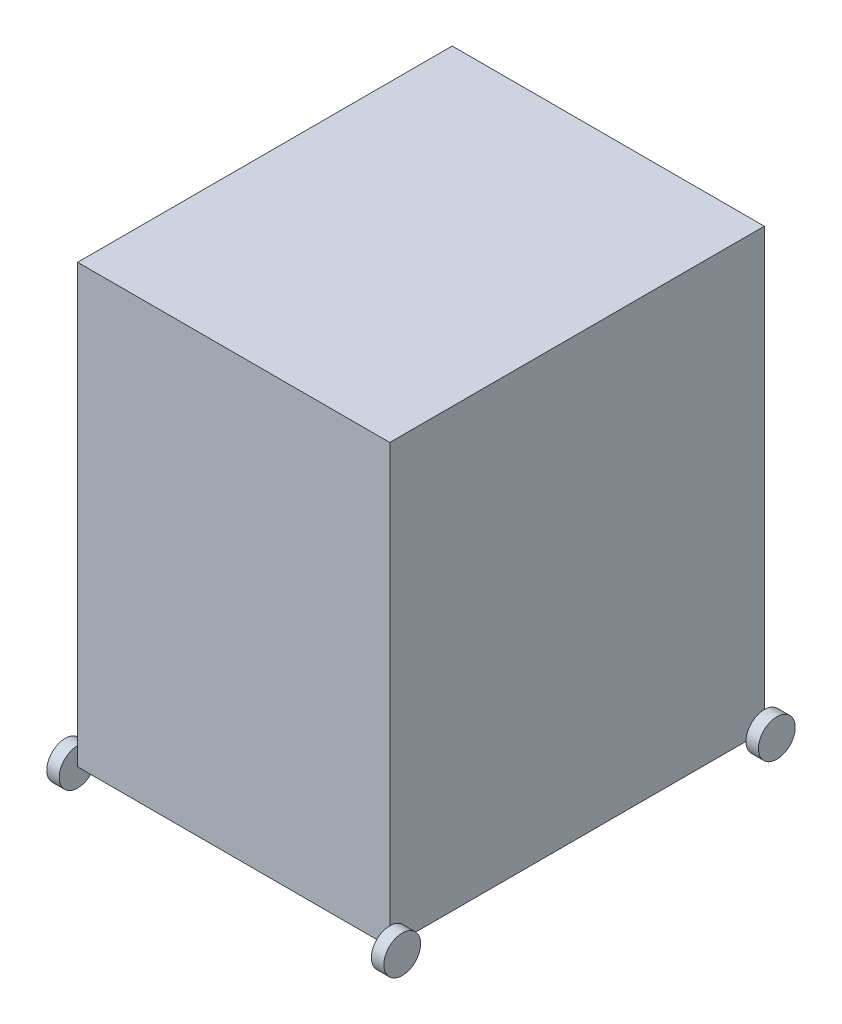
ISO-10303-21;
HEADER;
FILE_DESCRIPTION(('STEP AP214'),'2;1');
FILE_NAME('part.step','',(''),(''),'','','');
FILE_SCHEMA(('AUTOMOTIVE_DESIGN { 1 0 10303 214 1 1 1 1 }'));
ENDSEC;
DATA;
#1=APPLICATION_CONTEXT('core data for automotive mechanical design processes');
#2=APPLICATION_PROTOCOL_DEFINITION('international standard','automotive_design',2000,#1);
#3=PRODUCT_CONTEXT('',#1,'mechanical');
#4=PRODUCT('Part','Part','',(#3));
#5=PRODUCT_RELATED_PRODUCT_CATEGORY('part','',(#4));
#6=PRODUCT_DEFINITION_FORMATION('','',#4);
#7=PRODUCT_DEFINITION_CONTEXT('part definition',#1,'design');
#8=PRODUCT_DEFINITION('design','',#6,#7);
#9=PRODUCT_DEFINITION_SHAPE('','',#8);
#10=(LENGTH_UNIT() NAMED_UNIT(*) SI_UNIT(.MILLI.,.METRE.));
#11=(NAMED_UNIT(*) PLANE_ANGLE_UNIT() SI_UNIT($,.RADIAN.));
#12=(NAMED_UNIT(*) SI_UNIT($,.STERADIAN.) SOLID_ANGLE_UNIT());
#13=UNCERTAINTY_MEASURE_WITH_UNIT(LENGTH_MEASURE(1.E-05),#10,'distance_accuracy_value','');
#14=(GEOMETRIC_REPRESENTATION_CONTEXT(3) GLOBAL_UNCERTAINTY_ASSIGNED_CONTEXT((#13)) GLOBAL_UNIT_ASSIGNED_CONTEXT((#10,
#11,#12)) REPRESENTATION_CONTEXT('',''));
#15=CARTESIAN_POINT('',(0.,0.,0.));
#16=DIRECTION('',(0.,0.,1.));
#17=DIRECTION('',(1.,0.,0.));
#18=AXIS2_PLACEMENT_3D('',#15,#16,#17);
#19=CARTESIAN_POINT('',(-154.444356890843,350.,75.1575717903757));
#20=DIRECTION('',(1.,0.,0.));
#21=DIRECTION('',(0.,0.,-1.));
#22=AXIS2_PLACEMENT_3D('',#19,#20,#21);
#23=PLANE('',#22);
#24=CARTESIAN_POINT('',(-154.444356890843,0.,-224.842428209624));
#25=DIRECTION('',(1.,0.,0.));
#26=DIRECTION('',(0.,0.,-1.));
#27=AXIS2_PLACEMENT_3D('',#24,#25,#26);
#28=CIRCLE('',#27,14.75);
#29=CARTESIAN_POINT('',(-154.444356890843,14.75,-224.842428209624));
#30=VERTEX_POINT('',#29);
#31=CARTESIAN_POINT('',(-154.444356890843,0.,-210.092428209624));
#32=VERTEX_POINT('',#31);
#33=EDGE_CURVE('E110',#30,#32,#28,.T.);
#34=ORIENTED_EDGE('',*,*,#33,.T.);
#35=DIRECTION('',(0.,0.,1.));
#36=VECTOR('',#35,1.);
#37=CARTESIAN_POINT('',(-154.444356890843,0.,75.1575717903757));
#38=LINE('',#37,#36);
#39=CARTESIAN_POINT('',(-154.444356890843,0.,60.4075717903757));
#40=VERTEX_POINT('',#39);
#41=EDGE_CURVE('E99',#32,#40,#38,.T.);
#42=ORIENTED_EDGE('',*,*,#41,.T.);
#43=CARTESIAN_POINT('',(-154.444356890843,0.,75.1575717903757));
#44=DIRECTION('',(1.,0.,0.));
#45=DIRECTION('',(0.,0.,-1.));
#46=AXIS2_PLACEMENT_3D('',#43,#44,#45);
#47=CIRCLE('',#46,14.75);
#48=CARTESIAN_POINT('',(-154.444356890843,14.75,75.1575717903757));
#49=VERTEX_POINT('',#48);
#50=EDGE_CURVE('E129',#40,#49,#47,.T.);
#51=ORIENTED_EDGE('',*,*,#50,.T.);
#52=DIRECTION('',(0.,-1.,0.));
#53=VECTOR('',#52,1.);
#54=CARTESIAN_POINT('',(-154.444356890843,350.,75.1575717903757));
#55=LINE('',#54,#53);
#56=CARTESIAN_POINT('',(-154.444356890843,350.,75.1575717903757));
#57=VERTEX_POINT('',#56);
#58=EDGE_CURVE('E11',#57,#49,#55,.T.);
#59=ORIENTED_EDGE('',*,*,#58,.F.);
#60=DIRECTION('',(0.,0.,1.));
#61=VECTOR('',#60,1.);
#62=CARTESIAN_POINT('',(-154.444356890843,350.,75.1575717903757));
#63=LINE('',#62,#61);
#64=CARTESIAN_POINT('',(-154.444356890843,350.,-224.842428209624));
#65=VERTEX_POINT('',#64);
#66=EDGE_CURVE('E150',#65,#57,#63,.T.);
#67=ORIENTED_EDGE('',*,*,#66,.F.);
#68=DIRECTION('',(0.,-1.,0.));
#69=VECTOR('',#68,1.);
#70=CARTESIAN_POINT('',(-154.444356890843,350.,-224.842428209624));
#71=LINE('',#70,#69);
#72=EDGE_CURVE('E112',#65,#30,#71,.T.);
#73=ORIENTED_EDGE('',*,*,#72,.T.);
#74=EDGE_LOOP('',(#34,#42,#51,#59,#67,#73));
#75=FACE_BOUND('',#74,.T.);
#76=ADVANCED_FACE('F33',(#75),#23,.F.);
#77=CARTESIAN_POINT('',(95.5556431091574,350.,75.1575717903757));
#78=DIRECTION('',(-1.,0.,0.));
#79=DIRECTION('',(0.,0.,1.));
#80=AXIS2_PLACEMENT_3D('',#77,#78,#79);
#81=PLANE('',#80);
#82=CARTESIAN_POINT('',(95.5556431091574,0.,-224.842428209624));
#83=DIRECTION('',(1.,0.,0.));
#84=DIRECTION('',(0.,0.,-1.));
#85=AXIS2_PLACEMENT_3D('',#82,#83,#84);
#86=CIRCLE('',#85,14.75);
#87=CARTESIAN_POINT('',(95.5556431091574,14.75,-224.842428209624));
#88=VERTEX_POINT('',#87);
#89=CARTESIAN_POINT('',(95.5556431091574,0.,-210.092428209624));
#90=VERTEX_POINT('',#89);
#91=EDGE_CURVE('E138',#88,#90,#86,.T.);
#92=ORIENTED_EDGE('',*,*,#91,.F.);
#93=DIRECTION('',(0.,-1.,0.));
#94=VECTOR('',#93,1.);
#95=CARTESIAN_POINT('',(95.5556431091574,350.,-224.842428209624));
#96=LINE('',#95,#94);
#97=CARTESIAN_POINT('',(95.5556431091574,350.,-224.842428209624));
#98=VERTEX_POINT('',#97);
#99=EDGE_CURVE('E168',#98,#88,#96,.T.);
#100=ORIENTED_EDGE('',*,*,#99,.F.);
#101=DIRECTION('',(0.,0.,-1.));
#102=VECTOR('',#101,1.);
#103=CARTESIAN_POINT('',(95.5556431091574,350.,75.1575717903757));
#104=LINE('',#103,#102);
#105=CARTESIAN_POINT('',(95.5556431091574,350.,75.1575717903757));
#106=VERTEX_POINT('',#105);
#107=EDGE_CURVE('E156',#106,#98,#104,.T.);
#108=ORIENTED_EDGE('',*,*,#107,.F.);
#109=DIRECTION('',(0.,-1.,0.));
#110=VECTOR('',#109,1.);
#111=CARTESIAN_POINT('',(95.5556431091574,350.,75.1575717903757));
#112=LINE('',#111,#110);
#113=CARTESIAN_POINT('',(95.5556431091574,14.75,75.1575717903757));
#114=VERTEX_POINT('',#113);
#115=EDGE_CURVE('E171',#106,#114,#112,.T.);
#116=ORIENTED_EDGE('',*,*,#115,.T.);
#117=CARTESIAN_POINT('',(95.5556431091574,0.,75.1575717903757));
#118=DIRECTION('',(1.,0.,0.));
#119=DIRECTION('',(0.,0.,-1.));
#120=AXIS2_PLACEMENT_3D('',#117,#118,#119);
#121=CIRCLE('',#120,14.75);
#122=CARTESIAN_POINT('',(95.5556431091574,0.,60.4075717903757));
#123=VERTEX_POINT('',#122);
#124=EDGE_CURVE('E147',#123,#114,#121,.T.);
#125=ORIENTED_EDGE('',*,*,#124,.F.);
#126=DIRECTION('',(0.,0.,-1.));
#127=VECTOR('',#126,1.);
#128=CARTESIAN_POINT('',(95.5556431091574,0.,75.1575717903757));
#129=LINE('',#128,#127);
#130=EDGE_CURVE('E165',#123,#90,#129,.T.);
#131=ORIENTED_EDGE('',*,*,#130,.T.);
#132=EDGE_LOOP('',(#92,#100,#108,#116,#125,#131));
#133=FACE_BOUND('',#132,.T.);
#134=ADVANCED_FACE('F196',(#133),#81,.F.);
#135=CARTESIAN_POINT('',(-154.444356890843,350.,75.1575717903757));
#136=DIRECTION('',(0.,0.,-1.));
#137=DIRECTION('',(-1.,0.,0.));
#138=AXIS2_PLACEMENT_3D('',#135,#136,#137);
#139=PLANE('',#138);
#140=DIRECTION('',(1.,0.,0.));
#141=VECTOR('',#140,1.);
#142=CARTESIAN_POINT('',(-154.444356890843,0.,75.1575717903757));
#143=LINE('',#142,#141);
#144=CARTESIAN_POINT('',(-154.444356890843,0.,75.1575717903757));
#145=VERTEX_POINT('',#144);
#146=CARTESIAN_POINT('',(95.5556431091574,0.,75.1575717903757));
#147=VERTEX_POINT('',#146);
#148=EDGE_CURVE('E120',#145,#147,#143,.T.);
#149=ORIENTED_EDGE('',*,*,#148,.T.);
#150=EDGE_CURVE('E170',#114,#147,#112,.T.);
#151=ORIENTED_EDGE('',*,*,#150,.F.);
#152=ORIENTED_EDGE('',*,*,#115,.F.);
#153=DIRECTION('',(1.,0.,0.));
#154=VECTOR('',#153,1.);
#155=CARTESIAN_POINT('',(-154.444356890843,350.,75.1575717903757));
#156=LINE('',#155,#154);
#157=EDGE_CURVE('E153',#57,#106,#156,.T.);
#158=ORIENTED_EDGE('',*,*,#157,.F.);
#159=ORIENTED_EDGE('',*,*,#58,.T.);
#160=EDGE_CURVE('E40',#49,#145,#55,.T.);
#161=ORIENTED_EDGE('',*,*,#160,.T.);
#162=EDGE_LOOP('',(#149,#151,#152,#158,#159,#161));
#163=FACE_BOUND('',#162,.T.);
#164=ADVANCED_FACE('F184',(#163),#139,.F.);
#165=CARTESIAN_POINT('',(-154.444356890843,350.,-224.842428209624));
#166=DIRECTION('',(0.,0.,1.));
#167=DIRECTION('',(1.,0.,0.));
#168=AXIS2_PLACEMENT_3D('',#165,#166,#167);
#169=PLANE('',#168);
#170=DIRECTION('',(-1.,0.,0.));
#171=VECTOR('',#170,1.);
#172=CARTESIAN_POINT('',(-154.444356890843,0.,-224.842428209624));
#173=LINE('',#172,#171);
#174=CARTESIAN_POINT('',(95.5556431091574,0.,-224.842428209624));
#175=VERTEX_POINT('',#174);
#176=CARTESIAN_POINT('',(-154.444356890843,0.,-224.842428209624));
#177=VERTEX_POINT('',#176);
#178=EDGE_CURVE('E154',#175,#177,#173,.T.);
#179=ORIENTED_EDGE('',*,*,#178,.T.);
#180=DIRECTION('',(0.,1.,0.));
#181=VECTOR('',#180,1.);
#182=CARTESIAN_POINT('',(-154.444356890843,350.,-224.842428209624));
#183=LINE('',#182,#181);
#184=EDGE_CURVE('E47',#177,#30,#183,.T.);
#185=ORIENTED_EDGE('',*,*,#184,.T.);
#186=ORIENTED_EDGE('',*,*,#72,.F.);
#187=DIRECTION('',(-1.,0.,0.));
#188=VECTOR('',#187,1.);
#189=CARTESIAN_POINT('',(-154.444356890843,350.,-224.842428209624));
#190=LINE('',#189,#188);
#191=EDGE_CURVE('E158',#98,#65,#190,.T.);
#192=ORIENTED_EDGE('',*,*,#191,.F.);
#193=ORIENTED_EDGE('',*,*,#99,.T.);
#194=DIRECTION('',(0.,1.,0.));
#195=VECTOR('',#194,1.);
#196=CARTESIAN_POINT('',(95.5556431091574,350.,-224.842428209624));
#197=LINE('',#196,#195);
#198=EDGE_CURVE('E137',#175,#88,#197,.T.);
#199=ORIENTED_EDGE('',*,*,#198,.F.);
#200=EDGE_LOOP('',(#179,#185,#186,#192,#193,#199));
#201=FACE_BOUND('',#200,.T.);
#202=ADVANCED_FACE('F198',(#201),#169,.F.);
#203=CARTESIAN_POINT('',(0.,350.,0.));
#204=DIRECTION('',(0.,-1.,0.));
#205=DIRECTION('',(0.,0.,-1.));
#206=AXIS2_PLACEMENT_3D('',#203,#204,#205);
#207=PLANE('',#206);
#208=ORIENTED_EDGE('',*,*,#66,.T.);
#209=ORIENTED_EDGE('',*,*,#157,.T.);
#210=ORIENTED_EDGE('',*,*,#107,.T.);
#211=ORIENTED_EDGE('',*,*,#191,.T.);
#212=EDGE_LOOP('',(#208,#209,#210,#211));
#213=FACE_BOUND('',#212,.T.);
#214=ADVANCED_FACE('F200',(#213),#207,.F.);
#215=CARTESIAN_POINT('',(0.,0.,0.));
#216=DIRECTION('',(0.,-1.,0.));
#217=DIRECTION('',(0.,0.,-1.));
#218=AXIS2_PLACEMENT_3D('',#215,#216,#217);
#219=PLANE('',#218);
#220=EDGE_CURVE('E103',#177,#32,#38,.T.);
#221=ORIENTED_EDGE('',*,*,#220,.F.);
#222=ORIENTED_EDGE('',*,*,#178,.F.);
#223=EDGE_CURVE('E161',#90,#175,#129,.T.);
#224=ORIENTED_EDGE('',*,*,#223,.F.);
#225=ORIENTED_EDGE('',*,*,#130,.F.);
#226=EDGE_CURVE('E162',#147,#123,#129,.T.);
#227=ORIENTED_EDGE('',*,*,#226,.F.);
#228=ORIENTED_EDGE('',*,*,#148,.F.);
#229=EDGE_CURVE('E105',#40,#145,#38,.T.);
#230=ORIENTED_EDGE('',*,*,#229,.F.);
#231=ORIENTED_EDGE('',*,*,#41,.F.);
#232=EDGE_LOOP('',(#221,#222,#224,#225,#227,#228,#230,#231));
#233=FACE_BOUND('',#232,.T.);
#234=ADVANCED_FACE('F101',(#233),#219,.T.);
#235=CARTESIAN_POINT('',(95.5556431091574,0.,75.1575717903757));
#236=DIRECTION('',(1.,0.,0.));
#237=DIRECTION('',(0.,0.,-1.));
#238=AXIS2_PLACEMENT_3D('',#235,#236,#237);
#239=PLANE('',#238);
#240=ORIENTED_EDGE('',*,*,#150,.T.);
#241=ORIENTED_EDGE('',*,*,#226,.T.);
#242=EDGE_CURVE('E143',#114,#123,#121,.T.);
#243=ORIENTED_EDGE('',*,*,#242,.F.);
#244=EDGE_LOOP('',(#240,#241,#243));
#245=FACE_BOUND('',#244,.T.);
#246=ADVANCED_FACE('F180',(#245),#239,.F.);
#247=CARTESIAN_POINT('',(105.555643109157,0.,75.1575717903757));
#248=DIRECTION('',(-1.,0.,0.));
#249=DIRECTION('',(0.,0.,1.));
#250=AXIS2_PLACEMENT_3D('',#247,#248,#249);
#251=CYLINDRICAL_SURFACE('',#250,14.75);
#252=CARTESIAN_POINT('',(105.555643109157,0.,75.1575717903757));
#253=DIRECTION('',(1.,0.,0.));
#254=DIRECTION('',(0.,0.,-1.));
#255=AXIS2_PLACEMENT_3D('',#252,#253,#254);
#256=CIRCLE('',#255,14.75);
#257=CARTESIAN_POINT('',(105.555643109157,0.,60.4075717903757));
#258=VERTEX_POINT('',#257);
#259=EDGE_CURVE('E144',#258,#258,#256,.T.);
#260=ORIENTED_EDGE('',*,*,#259,.F.);
#261=EDGE_LOOP('',(#260));
#262=FACE_BOUND('',#261,.T.);
#263=ORIENTED_EDGE('',*,*,#124,.T.);
#264=ORIENTED_EDGE('',*,*,#242,.T.);
#265=EDGE_LOOP('',(#263,#264));
#266=FACE_BOUND('',#265,.T.);
#267=ADVANCED_FACE('F235',(#262,#266),#251,.T.);
#268=CARTESIAN_POINT('',(105.555643109157,0.,75.1575717903757));
#269=DIRECTION('',(1.,0.,0.));
#270=DIRECTION('',(0.,0.,-1.));
#271=AXIS2_PLACEMENT_3D('',#268,#269,#270);
#272=PLANE('',#271);
#273=ORIENTED_EDGE('',*,*,#259,.T.);
#274=EDGE_LOOP('',(#273));
#275=FACE_BOUND('',#274,.T.);
#276=ADVANCED_FACE('F238',(#275),#272,.T.);
#277=CARTESIAN_POINT('',(95.5556431091574,0.,-224.842428209624));
#278=DIRECTION('',(1.,0.,0.));
#279=DIRECTION('',(0.,0.,-1.));
#280=AXIS2_PLACEMENT_3D('',#277,#278,#279);
#281=PLANE('',#280);
#282=ORIENTED_EDGE('',*,*,#223,.T.);
#283=ORIENTED_EDGE('',*,*,#198,.T.);
#284=EDGE_CURVE('E131',#90,#88,#86,.T.);
#285=ORIENTED_EDGE('',*,*,#284,.F.);
#286=EDGE_LOOP('',(#282,#283,#285));
#287=FACE_BOUND('',#286,.T.);
#288=ADVANCED_FACE('F190',(#287),#281,.F.);
#289=CARTESIAN_POINT('',(105.555643109157,0.,-224.842428209624));
#290=DIRECTION('',(-1.,0.,0.));
#291=DIRECTION('',(0.,0.,1.));
#292=AXIS2_PLACEMENT_3D('',#289,#290,#291);
#293=CYLINDRICAL_SURFACE('',#292,14.75);
#294=CARTESIAN_POINT('',(105.555643109157,0.,-224.842428209624));
#295=DIRECTION('',(1.,0.,0.));
#296=DIRECTION('',(0.,0.,-1.));
#297=AXIS2_PLACEMENT_3D('',#294,#295,#296);
#298=CIRCLE('',#297,14.75);
#299=CARTESIAN_POINT('',(105.555643109157,0.,-239.592428209624));
#300=VERTEX_POINT('',#299);
#301=EDGE_CURVE('E134',#300,#300,#298,.T.);
#302=ORIENTED_EDGE('',*,*,#301,.F.);
#303=EDGE_LOOP('',(#302));
#304=FACE_BOUND('',#303,.T.);
#305=ORIENTED_EDGE('',*,*,#91,.T.);
#306=ORIENTED_EDGE('',*,*,#284,.T.);
#307=EDGE_LOOP('',(#305,#306));
#308=FACE_BOUND('',#307,.T.);
#309=ADVANCED_FACE('F194',(#304,#308),#293,.T.);
#310=CARTESIAN_POINT('',(105.555643109157,0.,-224.842428209624));
#311=DIRECTION('',(1.,0.,0.));
#312=DIRECTION('',(0.,0.,-1.));
#313=AXIS2_PLACEMENT_3D('',#310,#311,#312);
#314=PLANE('',#313);
#315=ORIENTED_EDGE('',*,*,#301,.T.);
#316=EDGE_LOOP('',(#315));
#317=FACE_BOUND('',#316,.T.);
#318=ADVANCED_FACE('F206',(#317),#314,.T.);
#319=CARTESIAN_POINT('',(-154.444356890843,0.,75.1575717903757));
#320=DIRECTION('',(-1.,0.,0.));
#321=DIRECTION('',(0.,0.,1.));
#322=AXIS2_PLACEMENT_3D('',#319,#320,#321);
#323=CYLINDRICAL_SURFACE('',#322,14.75);
#324=ORIENTED_EDGE('',*,*,#50,.F.);
#325=EDGE_CURVE('E54',#49,#40,#47,.T.);
#326=ORIENTED_EDGE('',*,*,#325,.F.);
#327=EDGE_LOOP('',(#324,#326));
#328=FACE_BOUND('',#327,.T.);
#329=CARTESIAN_POINT('',(-164.444356890843,0.,75.1575717903757));
#330=DIRECTION('',(1.,0.,0.));
#331=DIRECTION('',(0.,0.,-1.));
#332=AXIS2_PLACEMENT_3D('',#329,#330,#331);
#333=CIRCLE('',#332,14.75);
#334=CARTESIAN_POINT('',(-164.444356890843,0.,60.4075717903757));
#335=VERTEX_POINT('',#334);
#336=EDGE_CURVE('E128',#335,#335,#333,.T.);
#337=ORIENTED_EDGE('',*,*,#336,.T.);
#338=EDGE_LOOP('',(#337));
#339=FACE_BOUND('',#338,.T.);
#340=ADVANCED_FACE('F202',(#328,#339),#323,.T.);
#341=CARTESIAN_POINT('',(-154.444356890843,0.,75.1575717903757));
#342=DIRECTION('',(1.,0.,0.));
#343=DIRECTION('',(0.,0.,-1.));
#344=AXIS2_PLACEMENT_3D('',#341,#342,#343);
#345=PLANE('',#344);
#346=ORIENTED_EDGE('',*,*,#325,.T.);
#347=ORIENTED_EDGE('',*,*,#229,.T.);
#348=ORIENTED_EDGE('',*,*,#160,.F.);
#349=EDGE_LOOP('',(#346,#347,#348));
#350=FACE_BOUND('',#349,.T.);
#351=ADVANCED_FACE('F205',(#350),#345,.T.);
#352=CARTESIAN_POINT('',(-164.444356890843,0.,75.1575717903757));
#353=DIRECTION('',(1.,0.,0.));
#354=DIRECTION('',(0.,0.,-1.));
#355=AXIS2_PLACEMENT_3D('',#352,#353,#354);
#356=PLANE('',#355);
#357=ORIENTED_EDGE('',*,*,#336,.F.);
#358=EDGE_LOOP('',(#357));
#359=FACE_BOUND('',#358,.T.);
#360=ADVANCED_FACE('F210',(#359),#356,.F.);
#361=CARTESIAN_POINT('',(-154.444356890843,0.,-224.842428209624));
#362=DIRECTION('',(1.,0.,0.));
#363=DIRECTION('',(0.,0.,-1.));
#364=AXIS2_PLACEMENT_3D('',#361,#362,#363);
#365=PLANE('',#364);
#366=ORIENTED_EDGE('',*,*,#184,.F.);
#367=ORIENTED_EDGE('',*,*,#220,.T.);
#368=EDGE_CURVE('E116',#32,#30,#28,.T.);
#369=ORIENTED_EDGE('',*,*,#368,.T.);
#370=EDGE_LOOP('',(#366,#367,#369));
#371=FACE_BOUND('',#370,.T.);
#372=ADVANCED_FACE('F119',(#371),#365,.T.);
#373=CARTESIAN_POINT('',(-154.444356890843,0.,-224.842428209624));
#374=DIRECTION('',(-1.,0.,0.));
#375=DIRECTION('',(0.,0.,1.));
#376=AXIS2_PLACEMENT_3D('',#373,#374,#375);
#377=CYLINDRICAL_SURFACE('',#376,14.75);
#378=ORIENTED_EDGE('',*,*,#33,.F.);
#379=ORIENTED_EDGE('',*,*,#368,.F.);
#380=EDGE_LOOP('',(#378,#379));
#381=FACE_BOUND('',#380,.T.);
#382=CARTESIAN_POINT('',(-164.444356890843,0.,-224.842428209624));
#383=DIRECTION('',(1.,0.,0.));
#384=DIRECTION('',(0.,0.,-1.));
#385=AXIS2_PLACEMENT_3D('',#382,#383,#384);
#386=CIRCLE('',#385,14.75);
#387=CARTESIAN_POINT('',(-164.444356890843,0.,-239.592428209624));
#388=VERTEX_POINT('',#387);
#389=EDGE_CURVE('E123',#388,#388,#386,.T.);
#390=ORIENTED_EDGE('',*,*,#389,.T.);
#391=EDGE_LOOP('',(#390));
#392=FACE_BOUND('',#391,.T.);
#393=ADVANCED_FACE('F121',(#381,#392),#377,.T.);
#394=CARTESIAN_POINT('',(-164.444356890843,0.,-224.842428209624));
#395=DIRECTION('',(1.,0.,0.));
#396=DIRECTION('',(0.,0.,-1.));
#397=AXIS2_PLACEMENT_3D('',#394,#395,#396);
#398=PLANE('',#397);
#399=ORIENTED_EDGE('',*,*,#389,.F.);
#400=EDGE_LOOP('',(#399));
#401=FACE_BOUND('',#400,.T.);
#402=ADVANCED_FACE('F285',(#401),#398,.F.);
#403=CLOSED_SHELL('',(#76,#134,#164,#202,#214,#234,#246,#267,#276,#288,#309,#318,#340,#351,#360,
#372,#393,#402));
#404=MANIFOLD_SOLID_BREP('B2',#403);
#405=ADVANCED_BREP_SHAPE_REPRESENTATION('',(#18,#404),#14);
#406=SHAPE_DEFINITION_REPRESENTATION(#9,#405);
ENDSEC;
END-ISO-10303-21;
